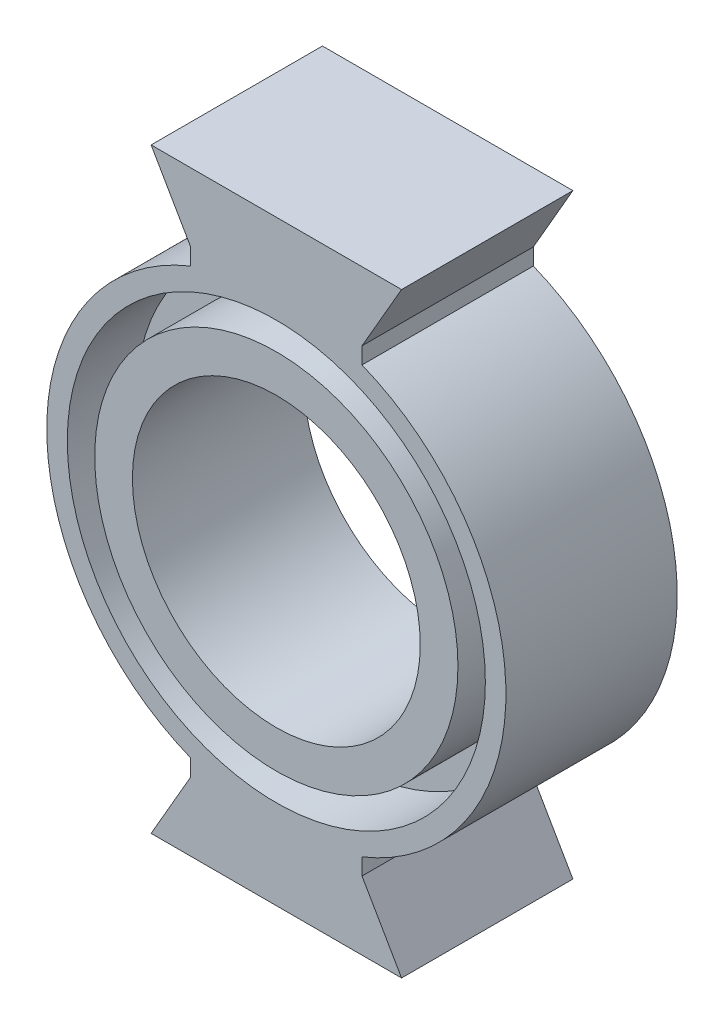
ISO-10303-21;
HEADER;
FILE_DESCRIPTION(('STEP AP214'),'2;1');
FILE_NAME('part.step','',(''),(''),'','','');
FILE_SCHEMA(('AUTOMOTIVE_DESIGN { 1 0 10303 214 1 1 1 1 }'));
ENDSEC;
DATA;
#1=APPLICATION_CONTEXT('core data for automotive mechanical design processes');
#2=APPLICATION_PROTOCOL_DEFINITION('international standard','automotive_design',2000,#1);
#3=PRODUCT_CONTEXT('',#1,'mechanical');
#4=PRODUCT('Part','Part','',(#3));
#5=PRODUCT_RELATED_PRODUCT_CATEGORY('part','',(#4));
#6=PRODUCT_DEFINITION_FORMATION('','',#4);
#7=PRODUCT_DEFINITION_CONTEXT('part definition',#1,'design');
#8=PRODUCT_DEFINITION('design','',#6,#7);
#9=PRODUCT_DEFINITION_SHAPE('','',#8);
#10=(LENGTH_UNIT() NAMED_UNIT(*) SI_UNIT(.MILLI.,.METRE.));
#11=(NAMED_UNIT(*) PLANE_ANGLE_UNIT() SI_UNIT($,.RADIAN.));
#12=(NAMED_UNIT(*) SI_UNIT($,.STERADIAN.) SOLID_ANGLE_UNIT());
#13=UNCERTAINTY_MEASURE_WITH_UNIT(LENGTH_MEASURE(1.E-05),#10,'distance_accuracy_value','');
#14=(GEOMETRIC_REPRESENTATION_CONTEXT(3) GLOBAL_UNCERTAINTY_ASSIGNED_CONTEXT((#13)) GLOBAL_UNIT_ASSIGNED_CONTEXT((#10,
#11,#12)) REPRESENTATION_CONTEXT('',''));
#15=CARTESIAN_POINT('',(0.,0.,0.));
#16=DIRECTION('',(0.,0.,1.));
#17=DIRECTION('',(1.,0.,0.));
#18=AXIS2_PLACEMENT_3D('',#15,#16,#17);
#19=CARTESIAN_POINT('',(0.,0.,0.));
#20=DIRECTION('',(0.,0.,1.));
#21=DIRECTION('',(1.,0.,0.));
#22=AXIS2_PLACEMENT_3D('',#19,#20,#21);
#23=PLANE('',#22);
#24=CARTESIAN_POINT('',(0.,0.,0.));
#25=DIRECTION('',(0.,0.,1.));
#26=DIRECTION('',(1.,0.,0.));
#27=AXIS2_PLACEMENT_3D('',#24,#25,#26);
#28=CIRCLE('',#27,5.334);
#29=CARTESIAN_POINT('',(5.334,0.,0.));
#30=VERTEX_POINT('',#29);
#31=EDGE_CURVE('E218',#30,#30,#28,.T.);
#32=ORIENTED_EDGE('',*,*,#31,.T.);
#33=EDGE_LOOP('',(#32));
#34=FACE_BOUND('',#33,.T.);
#35=CARTESIAN_POINT('',(0.,0.,0.));
#36=DIRECTION('',(0.,0.,1.));
#37=DIRECTION('',(1.,0.,0.));
#38=AXIS2_PLACEMENT_3D('',#35,#36,#37);
#39=CIRCLE('',#38,6.731);
#40=CARTESIAN_POINT('',(6.731,0.,0.));
#41=VERTEX_POINT('',#40);
#42=EDGE_CURVE('E331',#41,#41,#39,.T.);
#43=ORIENTED_EDGE('',*,*,#42,.F.);
#44=EDGE_LOOP('',(#43));
#45=FACE_BOUND('',#44,.T.);
#46=ADVANCED_FACE('F33',(#34,#45),#23,.F.);
#47=CARTESIAN_POINT('',(0.,0.,6.35));
#48=DIRECTION('',(0.,0.,-1.));
#49=DIRECTION('',(-1.,0.,0.));
#50=AXIS2_PLACEMENT_3D('',#47,#48,#49);
#51=CYLINDRICAL_SURFACE('',#50,8.509);
#52=CARTESIAN_POINT('',(0.,0.,6.35));
#53=DIRECTION('',(0.,0.,1.));
#54=DIRECTION('',(1.,0.,0.));
#55=AXIS2_PLACEMENT_3D('',#52,#53,#54);
#56=CIRCLE('',#55,8.509);
#57=CARTESIAN_POINT('',(3.175,-7.89445729610339,6.35));
#58=VERTEX_POINT('',#57);
#59=CARTESIAN_POINT('',(3.175,7.89445729610339,6.35));
#60=VERTEX_POINT('',#59);
#61=EDGE_CURVE('E42',#58,#60,#56,.T.);
#62=ORIENTED_EDGE('',*,*,#61,.F.);
#63=DIRECTION('',(0.,0.,-1.));
#64=VECTOR('',#63,1.);
#65=CARTESIAN_POINT('',(3.175,-7.89445729610339,16.1542900289149));
#66=LINE('',#65,#64);
#67=CARTESIAN_POINT('',(3.175,-7.89445729610339,0.));
#68=VERTEX_POINT('',#67);
#69=EDGE_CURVE('E144',#58,#68,#66,.T.);
#70=ORIENTED_EDGE('',*,*,#69,.T.);
#71=CARTESIAN_POINT('',(0.,0.,0.));
#72=DIRECTION('',(0.,0.,1.));
#73=DIRECTION('',(1.,0.,0.));
#74=AXIS2_PLACEMENT_3D('',#71,#72,#73);
#75=CIRCLE('',#74,8.509);
#76=CARTESIAN_POINT('',(3.175,7.89445729610339,0.));
#77=VERTEX_POINT('',#76);
#78=EDGE_CURVE('E224',#68,#77,#75,.T.);
#79=ORIENTED_EDGE('',*,*,#78,.T.);
#80=DIRECTION('',(0.,0.,-1.));
#81=VECTOR('',#80,1.);
#82=CARTESIAN_POINT('',(3.175,7.89445729610339,16.1542900289149));
#83=LINE('',#82,#81);
#84=EDGE_CURVE('E186',#60,#77,#83,.T.);
#85=ORIENTED_EDGE('',*,*,#84,.F.);
#86=EDGE_LOOP('',(#62,#70,#79,#85));
#87=FACE_BOUND('',#86,.T.);
#88=ADVANCED_FACE('F246',(#87),#51,.T.);
#89=CARTESIAN_POINT('',(-3.175,7.89445729610339,0.));
#90=VERTEX_POINT('',#89);
#91=CARTESIAN_POINT('',(-3.175,-7.89445729610339,0.));
#92=VERTEX_POINT('',#91);
#93=EDGE_CURVE('E37',#90,#92,#75,.T.);
#94=ORIENTED_EDGE('',*,*,#93,.T.);
#95=DIRECTION('',(0.,0.,-1.));
#96=VECTOR('',#95,1.);
#97=CARTESIAN_POINT('',(-3.175,-7.89445729610339,16.1542900289149));
#98=LINE('',#97,#96);
#99=CARTESIAN_POINT('',(-3.175,-7.89445729610339,6.35));
#100=VERTEX_POINT('',#99);
#101=EDGE_CURVE('E56',#100,#92,#98,.T.);
#102=ORIENTED_EDGE('',*,*,#101,.F.);
#103=CARTESIAN_POINT('',(-3.175,7.89445729610339,6.35));
#104=VERTEX_POINT('',#103);
#105=EDGE_CURVE('E11',#104,#100,#56,.T.);
#106=ORIENTED_EDGE('',*,*,#105,.F.);
#107=DIRECTION('',(0.,0.,-1.));
#108=VECTOR('',#107,1.);
#109=CARTESIAN_POINT('',(-3.175,7.89445729610339,16.1542900289149));
#110=LINE('',#109,#108);
#111=EDGE_CURVE('E166',#104,#90,#110,.T.);
#112=ORIENTED_EDGE('',*,*,#111,.T.);
#113=EDGE_LOOP('',(#94,#102,#106,#112));
#114=FACE_BOUND('',#113,.T.);
#115=ADVANCED_FACE('F35',(#114),#51,.T.);
#116=CARTESIAN_POINT('',(0.,0.,6.35));
#117=DIRECTION('',(0.,0.,1.));
#118=DIRECTION('',(1.,0.,0.));
#119=AXIS2_PLACEMENT_3D('',#116,#117,#118);
#120=PLANE('',#119);
#121=CARTESIAN_POINT('',(0.,0.,6.35));
#122=DIRECTION('',(0.,0.,1.));
#123=DIRECTION('',(1.,0.,0.));
#124=AXIS2_PLACEMENT_3D('',#121,#122,#123);
#125=CIRCLE('',#124,5.334);
#126=CARTESIAN_POINT('',(5.334,0.,6.35));
#127=VERTEX_POINT('',#126);
#128=EDGE_CURVE('E221',#127,#127,#125,.T.);
#129=ORIENTED_EDGE('',*,*,#128,.F.);
#130=EDGE_LOOP('',(#129));
#131=FACE_BOUND('',#130,.T.);
#132=CARTESIAN_POINT('',(0.,0.,6.35));
#133=DIRECTION('',(0.,0.,1.));
#134=DIRECTION('',(1.,0.,0.));
#135=AXIS2_PLACEMENT_3D('',#132,#133,#134);
#136=CIRCLE('',#135,6.731);
#137=CARTESIAN_POINT('',(6.731,0.,6.35));
#138=VERTEX_POINT('',#137);
#139=EDGE_CURVE('E190',#138,#138,#136,.T.);
#140=ORIENTED_EDGE('',*,*,#139,.T.);
#141=EDGE_LOOP('',(#140));
#142=FACE_BOUND('',#141,.T.);
#143=ADVANCED_FACE('F251',(#131,#142),#120,.T.);
#144=CARTESIAN_POINT('',(0.,0.,6.35));
#145=DIRECTION('',(0.,0.,1.));
#146=DIRECTION('',(1.,0.,0.));
#147=AXIS2_PLACEMENT_3D('',#144,#145,#146);
#148=CIRCLE('',#147,7.747);
#149=CARTESIAN_POINT('',(7.747,0.,6.35));
#150=VERTEX_POINT('',#149);
#151=EDGE_CURVE('E212',#150,#150,#148,.T.);
#152=ORIENTED_EDGE('',*,*,#151,.F.);
#153=EDGE_LOOP('',(#152));
#154=FACE_BOUND('',#153,.T.);
#155=ORIENTED_EDGE('',*,*,#105,.T.);
#156=DIRECTION('',(0.,1.,0.));
#157=VECTOR('',#156,1.);
#158=CARTESIAN_POINT('',(-3.175,-7.89445729610339,6.35));
#159=LINE('',#158,#157);
#160=CARTESIAN_POINT('',(-3.175,-8.509,6.35));
#161=VERTEX_POINT('',#160);
#162=EDGE_CURVE('E152',#161,#100,#159,.T.);
#163=ORIENTED_EDGE('',*,*,#162,.F.);
#164=DIRECTION('',(0.500000000000004,0.866025403784436,0.));
#165=VECTOR('',#164,1.);
#166=CARTESIAN_POINT('',(-4.64146968374166,-11.049,6.35));
#167=LINE('',#166,#165);
#168=CARTESIAN_POINT('',(-4.64146968374166,-11.049,6.35));
#169=VERTEX_POINT('',#168);
#170=EDGE_CURVE('E156',#169,#161,#167,.T.);
#171=ORIENTED_EDGE('',*,*,#170,.F.);
#172=DIRECTION('',(-1.,0.,0.));
#173=VECTOR('',#172,1.);
#174=CARTESIAN_POINT('',(4.64146968374166,-11.049,6.35));
#175=LINE('',#174,#173);
#176=CARTESIAN_POINT('',(4.64146968374166,-11.049,6.35));
#177=VERTEX_POINT('',#176);
#178=EDGE_CURVE('E129',#177,#169,#175,.T.);
#179=ORIENTED_EDGE('',*,*,#178,.F.);
#180=DIRECTION('',(0.500000000000004,-0.866025403784436,0.));
#181=VECTOR('',#180,1.);
#182=CARTESIAN_POINT('',(3.175,-8.509,6.35));
#183=LINE('',#182,#181);
#184=CARTESIAN_POINT('',(3.175,-8.509,6.35));
#185=VERTEX_POINT('',#184);
#186=EDGE_CURVE('E122',#185,#177,#183,.T.);
#187=ORIENTED_EDGE('',*,*,#186,.F.);
#188=DIRECTION('',(0.,-1.,0.));
#189=VECTOR('',#188,1.);
#190=CARTESIAN_POINT('',(3.175,-7.89445729610339,6.35));
#191=LINE('',#190,#189);
#192=EDGE_CURVE('E126',#58,#185,#191,.T.);
#193=ORIENTED_EDGE('',*,*,#192,.F.);
#194=ORIENTED_EDGE('',*,*,#61,.T.);
#195=DIRECTION('',(0.,1.,0.));
#196=VECTOR('',#195,1.);
#197=CARTESIAN_POINT('',(3.175,7.89445729610339,6.35));
#198=LINE('',#197,#196);
#199=CARTESIAN_POINT('',(3.175,8.509,6.35));
#200=VERTEX_POINT('',#199);
#201=EDGE_CURVE('E197',#60,#200,#198,.T.);
#202=ORIENTED_EDGE('',*,*,#201,.T.);
#203=DIRECTION('',(0.500000000000004,0.866025403784436,0.));
#204=VECTOR('',#203,1.);
#205=CARTESIAN_POINT('',(3.175,8.509,6.35));
#206=LINE('',#205,#204);
#207=CARTESIAN_POINT('',(4.64146968374166,11.049,6.35));
#208=VERTEX_POINT('',#207);
#209=EDGE_CURVE('E194',#200,#208,#206,.T.);
#210=ORIENTED_EDGE('',*,*,#209,.T.);
#211=DIRECTION('',(-1.,0.,0.));
#212=VECTOR('',#211,1.);
#213=CARTESIAN_POINT('',(4.64146968374166,11.049,6.35));
#214=LINE('',#213,#212);
#215=CARTESIAN_POINT('',(-4.64146968374166,11.049,6.35));
#216=VERTEX_POINT('',#215);
#217=EDGE_CURVE('E191',#208,#216,#214,.T.);
#218=ORIENTED_EDGE('',*,*,#217,.T.);
#219=DIRECTION('',(0.500000000000004,-0.866025403784436,0.));
#220=VECTOR('',#219,1.);
#221=CARTESIAN_POINT('',(-4.64146968374166,11.049,6.35));
#222=LINE('',#221,#220);
#223=CARTESIAN_POINT('',(-3.175,8.509,6.35));
#224=VERTEX_POINT('',#223);
#225=EDGE_CURVE('E187',#216,#224,#222,.T.);
#226=ORIENTED_EDGE('',*,*,#225,.T.);
#227=DIRECTION('',(0.,-1.,0.));
#228=VECTOR('',#227,1.);
#229=CARTESIAN_POINT('',(-3.175,7.89445729610339,6.35));
#230=LINE('',#229,#228);
#231=EDGE_CURVE('E169',#224,#104,#230,.T.);
#232=ORIENTED_EDGE('',*,*,#231,.T.);
#233=EDGE_LOOP('',(#155,#163,#171,#179,#187,#193,#194,#202,#210,#218,#226,#232));
#234=FACE_BOUND('',#233,.T.);
#235=ADVANCED_FACE('F124',(#154,#234),#120,.T.);
#236=CARTESIAN_POINT('',(0.,0.,0.));
#237=DIRECTION('',(0.,0.,1.));
#238=DIRECTION('',(1.,0.,0.));
#239=AXIS2_PLACEMENT_3D('',#236,#237,#238);
#240=CIRCLE('',#239,7.747);
#241=CARTESIAN_POINT('',(7.747,0.,0.));
#242=VERTEX_POINT('',#241);
#243=EDGE_CURVE('E333',#242,#242,#240,.T.);
#244=ORIENTED_EDGE('',*,*,#243,.T.);
#245=EDGE_LOOP('',(#244));
#246=FACE_BOUND('',#245,.T.);
#247=ORIENTED_EDGE('',*,*,#93,.F.);
#248=DIRECTION('',(0.,-1.,0.));
#249=VECTOR('',#248,1.);
#250=CARTESIAN_POINT('',(-3.175,7.89445729610339,0.));
#251=LINE('',#250,#249);
#252=CARTESIAN_POINT('',(-3.175,8.509,0.));
#253=VERTEX_POINT('',#252);
#254=EDGE_CURVE('E167',#253,#90,#251,.T.);
#255=ORIENTED_EDGE('',*,*,#254,.F.);
#256=DIRECTION('',(0.500000000000004,-0.866025403784436,0.));
#257=VECTOR('',#256,1.);
#258=CARTESIAN_POINT('',(-4.64146968374166,11.049,0.));
#259=LINE('',#258,#257);
#260=CARTESIAN_POINT('',(-4.64146968374166,11.049,0.));
#261=VERTEX_POINT('',#260);
#262=EDGE_CURVE('E171',#261,#253,#259,.T.);
#263=ORIENTED_EDGE('',*,*,#262,.F.);
#264=DIRECTION('',(-1.,0.,0.));
#265=VECTOR('',#264,1.);
#266=CARTESIAN_POINT('',(4.64146968374166,11.049,0.));
#267=LINE('',#266,#265);
#268=CARTESIAN_POINT('',(4.64146968374166,11.049,0.));
#269=VERTEX_POINT('',#268);
#270=EDGE_CURVE('E175',#269,#261,#267,.T.);
#271=ORIENTED_EDGE('',*,*,#270,.F.);
#272=DIRECTION('',(0.500000000000004,0.866025403784436,0.));
#273=VECTOR('',#272,1.);
#274=CARTESIAN_POINT('',(3.175,8.509,0.));
#275=LINE('',#274,#273);
#276=CARTESIAN_POINT('',(3.175,8.509,0.));
#277=VERTEX_POINT('',#276);
#278=EDGE_CURVE('E179',#277,#269,#275,.T.);
#279=ORIENTED_EDGE('',*,*,#278,.F.);
#280=DIRECTION('',(0.,1.,0.));
#281=VECTOR('',#280,1.);
#282=CARTESIAN_POINT('',(3.175,7.89445729610339,0.));
#283=LINE('',#282,#281);
#284=EDGE_CURVE('E183',#77,#277,#283,.T.);
#285=ORIENTED_EDGE('',*,*,#284,.F.);
#286=ORIENTED_EDGE('',*,*,#78,.F.);
#287=DIRECTION('',(0.,-1.,0.));
#288=VECTOR('',#287,1.);
#289=CARTESIAN_POINT('',(3.175,-7.89445729610339,0.));
#290=LINE('',#289,#288);
#291=CARTESIAN_POINT('',(3.175,-8.509,0.));
#292=VERTEX_POINT('',#291);
#293=EDGE_CURVE('E339',#68,#292,#290,.T.);
#294=ORIENTED_EDGE('',*,*,#293,.T.);
#295=DIRECTION('',(0.500000000000004,-0.866025403784436,0.));
#296=VECTOR('',#295,1.);
#297=CARTESIAN_POINT('',(3.175,-8.509,0.));
#298=LINE('',#297,#296);
#299=CARTESIAN_POINT('',(4.64146968374166,-11.049,0.));
#300=VERTEX_POINT('',#299);
#301=EDGE_CURVE('E138',#292,#300,#298,.T.);
#302=ORIENTED_EDGE('',*,*,#301,.T.);
#303=DIRECTION('',(-1.,0.,0.));
#304=VECTOR('',#303,1.);
#305=CARTESIAN_POINT('',(4.64146968374166,-11.049,0.));
#306=LINE('',#305,#304);
#307=CARTESIAN_POINT('',(-4.64146968374166,-11.049,0.));
#308=VERTEX_POINT('',#307);
#309=EDGE_CURVE('E344',#300,#308,#306,.T.);
#310=ORIENTED_EDGE('',*,*,#309,.T.);
#311=DIRECTION('',(0.500000000000004,0.866025403784436,0.));
#312=VECTOR('',#311,1.);
#313=CARTESIAN_POINT('',(-4.64146968374166,-11.049,0.));
#314=LINE('',#313,#312);
#315=CARTESIAN_POINT('',(-3.175,-8.509,0.));
#316=VERTEX_POINT('',#315);
#317=EDGE_CURVE('E148',#308,#316,#314,.T.);
#318=ORIENTED_EDGE('',*,*,#317,.T.);
#319=DIRECTION('',(0.,1.,0.));
#320=VECTOR('',#319,1.);
#321=CARTESIAN_POINT('',(-3.175,-7.89445729610339,0.));
#322=LINE('',#321,#320);
#323=EDGE_CURVE('E145',#316,#92,#322,.T.);
#324=ORIENTED_EDGE('',*,*,#323,.T.);
#325=EDGE_LOOP('',(#247,#255,#263,#271,#279,#285,#286,#294,#302,#310,#318,#324));
#326=FACE_BOUND('',#325,.T.);
#327=ADVANCED_FACE('F233',(#246,#326),#23,.F.);
#328=CARTESIAN_POINT('',(0.,0.,6.35));
#329=DIRECTION('',(0.,0.,-1.));
#330=DIRECTION('',(-1.,0.,0.));
#331=AXIS2_PLACEMENT_3D('',#328,#329,#330);
#332=CYLINDRICAL_SURFACE('',#331,5.334);
#333=ORIENTED_EDGE('',*,*,#128,.T.);
#334=EDGE_LOOP('',(#333));
#335=FACE_BOUND('',#334,.T.);
#336=ORIENTED_EDGE('',*,*,#31,.F.);
#337=EDGE_LOOP('',(#336));
#338=FACE_BOUND('',#337,.T.);
#339=ADVANCED_FACE('F230',(#335,#338),#332,.F.);
#340=CARTESIAN_POINT('',(0.,0.,3.81));
#341=DIRECTION('',(0.,0.,1.));
#342=DIRECTION('',(1.,0.,0.));
#343=AXIS2_PLACEMENT_3D('',#340,#341,#342);
#344=CYLINDRICAL_SURFACE('',#343,7.747);
#345=CARTESIAN_POINT('',(0.,0.,3.81));
#346=DIRECTION('',(0.,0.,1.));
#347=DIRECTION('',(1.,0.,0.));
#348=AXIS2_PLACEMENT_3D('',#345,#346,#347);
#349=CIRCLE('',#348,7.747);
#350=CARTESIAN_POINT('',(7.747,0.,3.81));
#351=VERTEX_POINT('',#350);
#352=EDGE_CURVE('E215',#351,#351,#349,.T.);
#353=ORIENTED_EDGE('',*,*,#352,.F.);
#354=EDGE_LOOP('',(#353));
#355=FACE_BOUND('',#354,.T.);
#356=ORIENTED_EDGE('',*,*,#151,.T.);
#357=EDGE_LOOP('',(#356));
#358=FACE_BOUND('',#357,.T.);
#359=ADVANCED_FACE('F232',(#355,#358),#344,.F.);
#360=CARTESIAN_POINT('',(0.,0.,3.81));
#361=DIRECTION('',(0.,0.,1.));
#362=DIRECTION('',(1.,0.,0.));
#363=AXIS2_PLACEMENT_3D('',#360,#361,#362);
#364=PLANE('',#363);
#365=CARTESIAN_POINT('',(0.,0.,3.81));
#366=DIRECTION('',(0.,0.,1.));
#367=DIRECTION('',(1.,0.,0.));
#368=AXIS2_PLACEMENT_3D('',#365,#366,#367);
#369=CIRCLE('',#368,6.731);
#370=CARTESIAN_POINT('',(6.731,0.,3.81));
#371=VERTEX_POINT('',#370);
#372=EDGE_CURVE('E209',#371,#371,#369,.T.);
#373=ORIENTED_EDGE('',*,*,#372,.F.);
#374=EDGE_LOOP('',(#373));
#375=FACE_BOUND('',#374,.T.);
#376=ORIENTED_EDGE('',*,*,#352,.T.);
#377=EDGE_LOOP('',(#376));
#378=FACE_BOUND('',#377,.T.);
#379=ADVANCED_FACE('F240',(#375,#378),#364,.T.);
#380=CARTESIAN_POINT('',(0.,0.,3.81));
#381=DIRECTION('',(0.,0.,1.));
#382=DIRECTION('',(1.,0.,0.));
#383=AXIS2_PLACEMENT_3D('',#380,#381,#382);
#384=CYLINDRICAL_SURFACE('',#383,6.731);
#385=ORIENTED_EDGE('',*,*,#372,.T.);
#386=EDGE_LOOP('',(#385));
#387=FACE_BOUND('',#386,.T.);
#388=ORIENTED_EDGE('',*,*,#139,.F.);
#389=EDGE_LOOP('',(#388));
#390=FACE_BOUND('',#389,.T.);
#391=ADVANCED_FACE('F266',(#387,#390),#384,.T.);
#392=CARTESIAN_POINT('',(3.175,7.89445729610339,16.1542900289149));
#393=DIRECTION('',(-1.,0.,0.));
#394=DIRECTION('',(0.,0.,1.));
#395=AXIS2_PLACEMENT_3D('',#392,#393,#394);
#396=PLANE('',#395);
#397=ORIENTED_EDGE('',*,*,#201,.F.);
#398=ORIENTED_EDGE('',*,*,#84,.T.);
#399=ORIENTED_EDGE('',*,*,#284,.T.);
#400=DIRECTION('',(0.,0.,-1.));
#401=VECTOR('',#400,1.);
#402=CARTESIAN_POINT('',(3.175,8.509,16.1542900289149));
#403=LINE('',#402,#401);
#404=EDGE_CURVE('E182',#200,#277,#403,.T.);
#405=ORIENTED_EDGE('',*,*,#404,.F.);
#406=EDGE_LOOP('',(#397,#398,#399,#405));
#407=FACE_BOUND('',#406,.T.);
#408=ADVANCED_FACE('F268',(#407),#396,.F.);
#409=CARTESIAN_POINT('',(3.175,8.509,16.1542900289149));
#410=DIRECTION('',(-0.866025403784436,0.500000000000004,0.));
#411=DIRECTION('',(-0.500000000000004,-0.866025403784436,0.));
#412=AXIS2_PLACEMENT_3D('',#409,#410,#411);
#413=PLANE('',#412);
#414=ORIENTED_EDGE('',*,*,#209,.F.);
#415=ORIENTED_EDGE('',*,*,#404,.T.);
#416=ORIENTED_EDGE('',*,*,#278,.T.);
#417=DIRECTION('',(0.,0.,-1.));
#418=VECTOR('',#417,1.);
#419=CARTESIAN_POINT('',(4.64146968374166,11.049,16.1542900289149));
#420=LINE('',#419,#418);
#421=EDGE_CURVE('E178',#208,#269,#420,.T.);
#422=ORIENTED_EDGE('',*,*,#421,.F.);
#423=EDGE_LOOP('',(#414,#415,#416,#422));
#424=FACE_BOUND('',#423,.T.);
#425=ADVANCED_FACE('F275',(#424),#413,.F.);
#426=CARTESIAN_POINT('',(4.64146968374166,11.049,16.1542900289149));
#427=DIRECTION('',(0.,-1.,0.));
#428=DIRECTION('',(1.,0.,0.));
#429=AXIS2_PLACEMENT_3D('',#426,#427,#428);
#430=PLANE('',#429);
#431=ORIENTED_EDGE('',*,*,#217,.F.);
#432=ORIENTED_EDGE('',*,*,#421,.T.);
#433=ORIENTED_EDGE('',*,*,#270,.T.);
#434=DIRECTION('',(0.,0.,-1.));
#435=VECTOR('',#434,1.);
#436=CARTESIAN_POINT('',(-4.64146968374166,11.049,16.1542900289149));
#437=LINE('',#436,#435);
#438=EDGE_CURVE('E174',#216,#261,#437,.T.);
#439=ORIENTED_EDGE('',*,*,#438,.F.);
#440=EDGE_LOOP('',(#431,#432,#433,#439));
#441=FACE_BOUND('',#440,.T.);
#442=ADVANCED_FACE('F283',(#441),#430,.F.);
#443=CARTESIAN_POINT('',(-4.64146968374166,11.049,16.1542900289149));
#444=DIRECTION('',(0.866025403784436,0.500000000000004,0.));
#445=DIRECTION('',(-0.500000000000004,0.866025403784436,0.));
#446=AXIS2_PLACEMENT_3D('',#443,#444,#445);
#447=PLANE('',#446);
#448=ORIENTED_EDGE('',*,*,#225,.F.);
#449=ORIENTED_EDGE('',*,*,#438,.T.);
#450=ORIENTED_EDGE('',*,*,#262,.T.);
#451=DIRECTION('',(0.,0.,-1.));
#452=VECTOR('',#451,1.);
#453=CARTESIAN_POINT('',(-3.175,8.509,16.1542900289149));
#454=LINE('',#453,#452);
#455=EDGE_CURVE('E170',#224,#253,#454,.T.);
#456=ORIENTED_EDGE('',*,*,#455,.F.);
#457=EDGE_LOOP('',(#448,#449,#450,#456));
#458=FACE_BOUND('',#457,.T.);
#459=ADVANCED_FACE('F287',(#458),#447,.F.);
#460=CARTESIAN_POINT('',(-3.175,7.89445729610339,16.1542900289149));
#461=DIRECTION('',(1.,0.,0.));
#462=DIRECTION('',(0.,0.,-1.));
#463=AXIS2_PLACEMENT_3D('',#460,#461,#462);
#464=PLANE('',#463);
#465=ORIENTED_EDGE('',*,*,#231,.F.);
#466=ORIENTED_EDGE('',*,*,#455,.T.);
#467=ORIENTED_EDGE('',*,*,#254,.T.);
#468=ORIENTED_EDGE('',*,*,#111,.F.);
#469=EDGE_LOOP('',(#465,#466,#467,#468));
#470=FACE_BOUND('',#469,.T.);
#471=ADVANCED_FACE('F291',(#470),#464,.F.);
#472=CARTESIAN_POINT('',(3.175,-7.89445729610339,16.1542900289149));
#473=DIRECTION('',(1.,0.,0.));
#474=DIRECTION('',(0.,0.,-1.));
#475=AXIS2_PLACEMENT_3D('',#472,#473,#474);
#476=PLANE('',#475);
#477=ORIENTED_EDGE('',*,*,#69,.F.);
#478=ORIENTED_EDGE('',*,*,#192,.T.);
#479=DIRECTION('',(0.,0.,-1.));
#480=VECTOR('',#479,1.);
#481=CARTESIAN_POINT('',(3.175,-8.509,16.1542900289149));
#482=LINE('',#481,#480);
#483=EDGE_CURVE('E133',#185,#292,#482,.T.);
#484=ORIENTED_EDGE('',*,*,#483,.T.);
#485=ORIENTED_EDGE('',*,*,#293,.F.);
#486=EDGE_LOOP('',(#477,#478,#484,#485));
#487=FACE_BOUND('',#486,.T.);
#488=ADVANCED_FACE('F143',(#487),#476,.T.);
#489=CARTESIAN_POINT('',(3.175,-8.509,16.1542900289149));
#490=DIRECTION('',(0.866025403784436,0.500000000000004,0.));
#491=DIRECTION('',(-0.500000000000004,0.866025403784436,0.));
#492=AXIS2_PLACEMENT_3D('',#489,#490,#491);
#493=PLANE('',#492);
#494=ORIENTED_EDGE('',*,*,#483,.F.);
#495=ORIENTED_EDGE('',*,*,#186,.T.);
#496=DIRECTION('',(0.,0.,-1.));
#497=VECTOR('',#496,1.);
#498=CARTESIAN_POINT('',(4.64146968374166,-11.049,16.1542900289149));
#499=LINE('',#498,#497);
#500=EDGE_CURVE('E132',#177,#300,#499,.T.);
#501=ORIENTED_EDGE('',*,*,#500,.T.);
#502=ORIENTED_EDGE('',*,*,#301,.F.);
#503=EDGE_LOOP('',(#494,#495,#501,#502));
#504=FACE_BOUND('',#503,.T.);
#505=ADVANCED_FACE('F136',(#504),#493,.T.);
#506=CARTESIAN_POINT('',(4.64146968374166,-11.049,16.1542900289149));
#507=DIRECTION('',(0.,-1.,0.));
#508=DIRECTION('',(1.,0.,0.));
#509=AXIS2_PLACEMENT_3D('',#506,#507,#508);
#510=PLANE('',#509);
#511=ORIENTED_EDGE('',*,*,#500,.F.);
#512=ORIENTED_EDGE('',*,*,#178,.T.);
#513=DIRECTION('',(0.,0.,-1.));
#514=VECTOR('',#513,1.);
#515=CARTESIAN_POINT('',(-4.64146968374166,-11.049,16.1542900289149));
#516=LINE('',#515,#514);
#517=EDGE_CURVE('E159',#169,#308,#516,.T.);
#518=ORIENTED_EDGE('',*,*,#517,.T.);
#519=ORIENTED_EDGE('',*,*,#309,.F.);
#520=EDGE_LOOP('',(#511,#512,#518,#519));
#521=FACE_BOUND('',#520,.T.);
#522=ADVANCED_FACE('F300',(#521),#510,.T.);
#523=CARTESIAN_POINT('',(-4.64146968374166,-11.049,16.1542900289149));
#524=DIRECTION('',(-0.866025403784436,0.500000000000004,0.));
#525=DIRECTION('',(-0.500000000000004,-0.866025403784436,0.));
#526=AXIS2_PLACEMENT_3D('',#523,#524,#525);
#527=PLANE('',#526);
#528=ORIENTED_EDGE('',*,*,#517,.F.);
#529=ORIENTED_EDGE('',*,*,#170,.T.);
#530=DIRECTION('',(0.,0.,-1.));
#531=VECTOR('',#530,1.);
#532=CARTESIAN_POINT('',(-3.175,-8.509,16.1542900289149));
#533=LINE('',#532,#531);
#534=EDGE_CURVE('E155',#161,#316,#533,.T.);
#535=ORIENTED_EDGE('',*,*,#534,.T.);
#536=ORIENTED_EDGE('',*,*,#317,.F.);
#537=EDGE_LOOP('',(#528,#529,#535,#536));
#538=FACE_BOUND('',#537,.T.);
#539=ADVANCED_FACE('F303',(#538),#527,.T.);
#540=CARTESIAN_POINT('',(-3.175,-7.89445729610339,16.1542900289149));
#541=DIRECTION('',(-1.,0.,0.));
#542=DIRECTION('',(0.,0.,1.));
#543=AXIS2_PLACEMENT_3D('',#540,#541,#542);
#544=PLANE('',#543);
#545=ORIENTED_EDGE('',*,*,#534,.F.);
#546=ORIENTED_EDGE('',*,*,#162,.T.);
#547=ORIENTED_EDGE('',*,*,#101,.T.);
#548=ORIENTED_EDGE('',*,*,#323,.F.);
#549=EDGE_LOOP('',(#545,#546,#547,#548));
#550=FACE_BOUND('',#549,.T.);
#551=ADVANCED_FACE('F307',(#550),#544,.T.);
#552=CARTESIAN_POINT('',(0.,0.,2.54));
#553=DIRECTION('',(0.,0.,-1.));
#554=DIRECTION('',(1.,0.,0.));
#555=AXIS2_PLACEMENT_3D('',#552,#553,#554);
#556=PLANE('',#555);
#557=CARTESIAN_POINT('',(0.,0.,2.54));
#558=DIRECTION('',(0.,0.,1.));
#559=DIRECTION('',(1.,0.,0.));
#560=AXIS2_PLACEMENT_3D('',#557,#558,#559);
#561=CIRCLE('',#560,7.747);
#562=CARTESIAN_POINT('',(7.747,0.,2.54));
#563=VERTEX_POINT('',#562);
#564=EDGE_CURVE('E336',#563,#563,#561,.T.);
#565=ORIENTED_EDGE('',*,*,#564,.F.);
#566=EDGE_LOOP('',(#565));
#567=FACE_BOUND('',#566,.T.);
#568=CARTESIAN_POINT('',(0.,0.,2.54));
#569=DIRECTION('',(0.,0.,1.));
#570=DIRECTION('',(1.,0.,0.));
#571=AXIS2_PLACEMENT_3D('',#568,#569,#570);
#572=CIRCLE('',#571,6.731);
#573=CARTESIAN_POINT('',(6.731,0.,2.54));
#574=VERTEX_POINT('',#573);
#575=EDGE_CURVE('E328',#574,#574,#572,.T.);
#576=ORIENTED_EDGE('',*,*,#575,.T.);
#577=EDGE_LOOP('',(#576));
#578=FACE_BOUND('',#577,.T.);
#579=ADVANCED_FACE('F311',(#567,#578),#556,.T.);
#580=CARTESIAN_POINT('',(0.,0.,2.54));
#581=DIRECTION('',(0.,0.,-1.));
#582=DIRECTION('',(-1.,0.,0.));
#583=AXIS2_PLACEMENT_3D('',#580,#581,#582);
#584=CYLINDRICAL_SURFACE('',#583,7.747);
#585=ORIENTED_EDGE('',*,*,#564,.T.);
#586=EDGE_LOOP('',(#585));
#587=FACE_BOUND('',#586,.T.);
#588=ORIENTED_EDGE('',*,*,#243,.F.);
#589=EDGE_LOOP('',(#588));
#590=FACE_BOUND('',#589,.T.);
#591=ADVANCED_FACE('F313',(#587,#590),#584,.F.);
#592=CARTESIAN_POINT('',(0.,0.,2.54));
#593=DIRECTION('',(0.,0.,-1.));
#594=DIRECTION('',(-1.,0.,0.));
#595=AXIS2_PLACEMENT_3D('',#592,#593,#594);
#596=CYLINDRICAL_SURFACE('',#595,6.731);
#597=ORIENTED_EDGE('',*,*,#575,.F.);
#598=EDGE_LOOP('',(#597));
#599=FACE_BOUND('',#598,.T.);
#600=ORIENTED_EDGE('',*,*,#42,.T.);
#601=EDGE_LOOP('',(#600));
#602=FACE_BOUND('',#601,.T.);
#603=ADVANCED_FACE('F316',(#599,#602),#596,.T.);
#604=CLOSED_SHELL('',(#46,#88,#115,#143,#235,#327,#339,#359,#379,#391,#408,#425,#442,#459,#471,
#488,#505,#522,#539,#551,#579,#591,#603));
#605=MANIFOLD_SOLID_BREP('B2',#604);
#606=ADVANCED_BREP_SHAPE_REPRESENTATION('',(#18,#605),#14);
#607=SHAPE_DEFINITION_REPRESENTATION(#9,#606);
ENDSEC;
END-ISO-10303-21;
